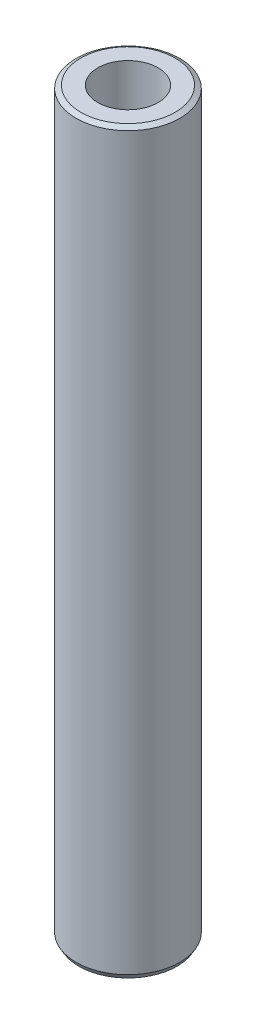
ISO-10303-21;
HEADER;
FILE_DESCRIPTION(('STEP AP214'),'2;1');
FILE_NAME('part.step','',(''),(''),'','','');
FILE_SCHEMA(('AUTOMOTIVE_DESIGN { 1 0 10303 214 1 1 1 1 }'));
ENDSEC;
DATA;
#1=APPLICATION_CONTEXT('core data for automotive mechanical design processes');
#2=APPLICATION_PROTOCOL_DEFINITION('international standard','automotive_design',2000,#1);
#3=PRODUCT_CONTEXT('',#1,'mechanical');
#4=PRODUCT('Part','Part','',(#3));
#5=PRODUCT_RELATED_PRODUCT_CATEGORY('part','',(#4));
#6=PRODUCT_DEFINITION_FORMATION('','',#4);
#7=PRODUCT_DEFINITION_CONTEXT('part definition',#1,'design');
#8=PRODUCT_DEFINITION('design','',#6,#7);
#9=PRODUCT_DEFINITION_SHAPE('','',#8);
#10=(LENGTH_UNIT() NAMED_UNIT(*) SI_UNIT(.MILLI.,.METRE.));
#11=(NAMED_UNIT(*) PLANE_ANGLE_UNIT() SI_UNIT($,.RADIAN.));
#12=(NAMED_UNIT(*) SI_UNIT($,.STERADIAN.) SOLID_ANGLE_UNIT());
#13=UNCERTAINTY_MEASURE_WITH_UNIT(LENGTH_MEASURE(1.E-05),#10,'distance_accuracy_value','');
#14=(GEOMETRIC_REPRESENTATION_CONTEXT(3) GLOBAL_UNCERTAINTY_ASSIGNED_CONTEXT((#13)) GLOBAL_UNIT_ASSIGNED_CONTEXT((#10,
#11,#12)) REPRESENTATION_CONTEXT('',''));
#15=CARTESIAN_POINT('',(0.,0.,0.));
#16=DIRECTION('',(0.,0.,1.));
#17=DIRECTION('',(1.,0.,0.));
#18=AXIS2_PLACEMENT_3D('',#15,#16,#17);
#19=CARTESIAN_POINT('',(0.,533.716949226487,0.));
#20=DIRECTION('',(0.,-1.,0.));
#21=DIRECTION('',(0.,0.,-1.));
#22=AXIS2_PLACEMENT_3D('',#19,#20,#21);
#23=CYLINDRICAL_SURFACE('',#22,37.5);
#24=CARTESIAN_POINT('',(0.,531.720913523426,0.));
#25=DIRECTION('',(0.,1.,0.));
#26=DIRECTION('',(0.,0.,1.));
#27=AXIS2_PLACEMENT_3D('',#24,#25,#26);
#28=CIRCLE('',#27,37.5);
#29=CARTESIAN_POINT('',(0.,531.720913523426,37.5));
#30=VERTEX_POINT('',#29);
#31=EDGE_CURVE('E50',#30,#30,#28,.F.);
#32=ORIENTED_EDGE('',*,*,#31,.T.);
#33=EDGE_LOOP('',(#32));
#34=FACE_BOUND('',#33,.T.);
#35=CARTESIAN_POINT('',(0.,3.45723525142339,0.));
#36=DIRECTION('',(0.,1.,0.));
#37=DIRECTION('',(0.,0.,1.));
#38=AXIS2_PLACEMENT_3D('',#35,#36,#37);
#39=CIRCLE('',#38,37.5);
#40=CARTESIAN_POINT('',(0.,3.45723525142339,37.5));
#41=VERTEX_POINT('',#40);
#42=EDGE_CURVE('E51',#41,#41,#39,.T.);
#43=ORIENTED_EDGE('',*,*,#42,.T.);
#44=EDGE_LOOP('',(#43));
#45=FACE_BOUND('',#44,.T.);
#46=ADVANCED_FACE('F39',(#34,#45),#23,.T.);
#47=CARTESIAN_POINT('',(0.,533.716949226487,0.));
#48=DIRECTION('',(0.,1.,0.));
#49=DIRECTION('',(0.,0.,1.));
#50=AXIS2_PLACEMENT_3D('',#47,#48,#49);
#51=PLANE('',#50);
#52=CARTESIAN_POINT('',(0.,533.716949226487,0.));
#53=DIRECTION('',(0.,1.,0.));
#54=DIRECTION('',(0.,0.,1.));
#55=AXIS2_PLACEMENT_3D('',#52,#53,#54);
#56=CIRCLE('',#55,34.0427647485765);
#57=CARTESIAN_POINT('',(0.,533.716949226487,34.0427647485765));
#58=VERTEX_POINT('',#57);
#59=EDGE_CURVE('E54',#58,#58,#56,.T.);
#60=ORIENTED_EDGE('',*,*,#59,.T.);
#61=EDGE_LOOP('',(#60));
#62=FACE_BOUND('',#61,.T.);
#63=CARTESIAN_POINT('',(0.,533.716949226487,0.));
#64=DIRECTION('',(0.,1.,0.));
#65=DIRECTION('',(0.,0.,1.));
#66=AXIS2_PLACEMENT_3D('',#63,#64,#65);
#67=CIRCLE('',#66,21.799693832751);
#68=CARTESIAN_POINT('',(0.,533.716949226487,21.799693832751));
#69=VERTEX_POINT('',#68);
#70=EDGE_CURVE('E58',#69,#69,#67,.T.);
#71=ORIENTED_EDGE('',*,*,#70,.F.);
#72=EDGE_LOOP('',(#71));
#73=FACE_BOUND('',#72,.T.);
#74=ADVANCED_FACE('F69',(#62,#73),#51,.T.);
#75=CARTESIAN_POINT('',(0.,0.,0.));
#76=DIRECTION('',(0.,1.,0.));
#77=DIRECTION('',(0.,0.,1.));
#78=AXIS2_PLACEMENT_3D('',#75,#76,#77);
#79=PLANE('',#78);
#80=CARTESIAN_POINT('',(0.,0.,0.));
#81=DIRECTION('',(0.,1.,0.));
#82=DIRECTION('',(0.,0.,1.));
#83=AXIS2_PLACEMENT_3D('',#80,#81,#82);
#84=CIRCLE('',#83,35.5039642969388);
#85=CARTESIAN_POINT('',(0.,0.,35.5039642969388));
#86=VERTEX_POINT('',#85);
#87=EDGE_CURVE('E10',#86,#86,#84,.F.);
#88=ORIENTED_EDGE('',*,*,#87,.T.);
#89=EDGE_LOOP('',(#88));
#90=FACE_BOUND('',#89,.T.);
#91=CARTESIAN_POINT('',(0.,0.,0.));
#92=DIRECTION('',(0.,1.,0.));
#93=DIRECTION('',(0.,0.,1.));
#94=AXIS2_PLACEMENT_3D('',#91,#92,#93);
#95=CIRCLE('',#94,21.799693832751);
#96=CARTESIAN_POINT('',(0.,0.,21.799693832751));
#97=VERTEX_POINT('',#96);
#98=EDGE_CURVE('E63',#97,#97,#95,.T.);
#99=ORIENTED_EDGE('',*,*,#98,.T.);
#100=EDGE_LOOP('',(#99));
#101=FACE_BOUND('',#100,.T.);
#102=ADVANCED_FACE('F75',(#90,#101),#79,.F.);
#103=CARTESIAN_POINT('',(0.,533.716949226487,0.));
#104=DIRECTION('',(0.,-1.,0.));
#105=DIRECTION('',(0.,0.,-1.));
#106=AXIS2_PLACEMENT_3D('',#103,#104,#105);
#107=CYLINDRICAL_SURFACE('',#106,21.799693832751);
#108=ORIENTED_EDGE('',*,*,#70,.T.);
#109=EDGE_LOOP('',(#108));
#110=FACE_BOUND('',#109,.T.);
#111=ORIENTED_EDGE('',*,*,#98,.F.);
#112=EDGE_LOOP('',(#111));
#113=FACE_BOUND('',#112,.T.);
#114=ADVANCED_FACE('F70',(#110,#113),#107,.F.);
#115=CARTESIAN_POINT('',(0.,533.716949226487,0.));
#116=DIRECTION('',(0.,-1.,0.));
#117=DIRECTION('',(0.,0.,-1.));
#118=AXIS2_PLACEMENT_3D('',#115,#116,#117);
#119=CONICAL_SURFACE('',#118,34.0427647485765,1.0471975511966);
#120=ORIENTED_EDGE('',*,*,#31,.F.);
#121=EDGE_LOOP('',(#120));
#122=FACE_BOUND('',#121,.T.);
#123=ORIENTED_EDGE('',*,*,#59,.F.);
#124=EDGE_LOOP('',(#123));
#125=FACE_BOUND('',#124,.T.);
#126=ADVANCED_FACE('F81',(#122,#125),#119,.T.);
#127=CARTESIAN_POINT('',(0.,3.45723525142339,0.));
#128=DIRECTION('',(0.,1.,0.));
#129=DIRECTION('',(0.,0.,1.));
#130=AXIS2_PLACEMENT_3D('',#127,#128,#129);
#131=CONICAL_SURFACE('',#130,37.5,0.523598775598315);
#132=ORIENTED_EDGE('',*,*,#87,.F.);
#133=EDGE_LOOP('',(#132));
#134=FACE_BOUND('',#133,.T.);
#135=ORIENTED_EDGE('',*,*,#42,.F.);
#136=EDGE_LOOP('',(#135));
#137=FACE_BOUND('',#136,.T.);
#138=ADVANCED_FACE('F45',(#134,#137),#131,.T.);
#139=CLOSED_SHELL('',(#46,#74,#102,#114,#126,#138));
#140=MANIFOLD_SOLID_BREP('B2',#139);
#141=ADVANCED_BREP_SHAPE_REPRESENTATION('',(#18,#140),#14);
#142=SHAPE_DEFINITION_REPRESENTATION(#9,#141);
ENDSEC;
END-ISO-10303-21;
